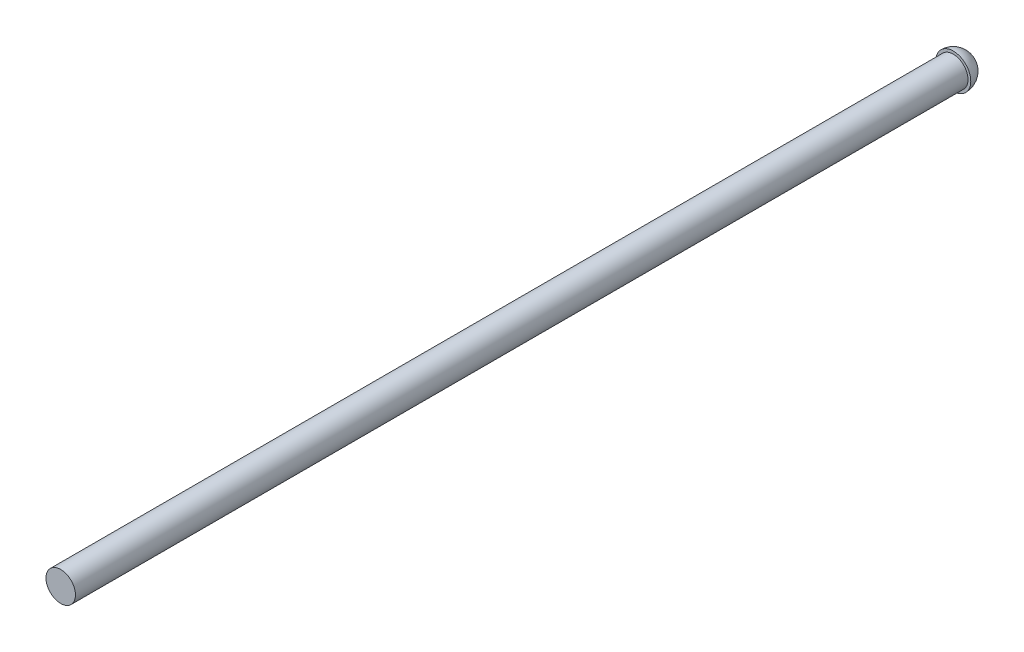
ISO-10303-21;
HEADER;
FILE_DESCRIPTION(('STEP AP214'),'2;1');
FILE_NAME('part.step','',(''),(''),'','','');
FILE_SCHEMA(('AUTOMOTIVE_DESIGN { 1 0 10303 214 1 1 1 1 }'));
ENDSEC;
DATA;
#1=APPLICATION_CONTEXT('core data for automotive mechanical design processes');
#2=APPLICATION_PROTOCOL_DEFINITION('international standard','automotive_design',2000,#1);
#3=PRODUCT_CONTEXT('',#1,'mechanical');
#4=PRODUCT('Part','Part','',(#3));
#5=PRODUCT_RELATED_PRODUCT_CATEGORY('part','',(#4));
#6=PRODUCT_DEFINITION_FORMATION('','',#4);
#7=PRODUCT_DEFINITION_CONTEXT('part definition',#1,'design');
#8=PRODUCT_DEFINITION('design','',#6,#7);
#9=PRODUCT_DEFINITION_SHAPE('','',#8);
#10=(LENGTH_UNIT() NAMED_UNIT(*) SI_UNIT(.MILLI.,.METRE.));
#11=(NAMED_UNIT(*) PLANE_ANGLE_UNIT() SI_UNIT($,.RADIAN.));
#12=(NAMED_UNIT(*) SI_UNIT($,.STERADIAN.) SOLID_ANGLE_UNIT());
#13=UNCERTAINTY_MEASURE_WITH_UNIT(LENGTH_MEASURE(1.E-05),#10,'distance_accuracy_value','');
#14=(GEOMETRIC_REPRESENTATION_CONTEXT(3) GLOBAL_UNCERTAINTY_ASSIGNED_CONTEXT((#13)) GLOBAL_UNIT_ASSIGNED_CONTEXT((#10,
#11,#12)) REPRESENTATION_CONTEXT('',''));
#15=CARTESIAN_POINT('',(0.,0.,0.));
#16=DIRECTION('',(0.,0.,1.));
#17=DIRECTION('',(1.,0.,0.));
#18=AXIS2_PLACEMENT_3D('',#15,#16,#17);
#19=CARTESIAN_POINT('',(-44.45,0.,-19.05));
#20=DIRECTION('',(0.,0.,1.));
#21=DIRECTION('',(1.,0.,0.));
#22=AXIS2_PLACEMENT_3D('',#19,#20,#21);
#23=CYLINDRICAL_SURFACE('',#22,5.35);
#24=CARTESIAN_POINT('',(-44.45,0.,-19.05));
#25=DIRECTION('',(0.,0.,1.));
#26=DIRECTION('',(1.,0.,0.));
#27=AXIS2_PLACEMENT_3D('',#24,#25,#26);
#28=CIRCLE('',#27,5.35);
#29=CARTESIAN_POINT('',(-39.1,0.,-19.05));
#30=VERTEX_POINT('',#29);
#31=EDGE_CURVE('E20',#30,#30,#28,.F.);
#32=ORIENTED_EDGE('',*,*,#31,.F.);
#33=EDGE_LOOP('',(#32));
#34=FACE_BOUND('',#33,.T.);
#35=CARTESIAN_POINT('',(-44.45,0.,304.8));
#36=DIRECTION('',(0.,0.,1.));
#37=DIRECTION('',(1.,0.,0.));
#38=AXIS2_PLACEMENT_3D('',#35,#36,#37);
#39=CIRCLE('',#38,5.35);
#40=CARTESIAN_POINT('',(-39.1,0.,304.8));
#41=VERTEX_POINT('',#40);
#42=EDGE_CURVE('E9',#41,#41,#39,.T.);
#43=ORIENTED_EDGE('',*,*,#42,.F.);
#44=EDGE_LOOP('',(#43));
#45=FACE_BOUND('',#44,.T.);
#46=ADVANCED_FACE('F14',(#34,#45),#23,.T.);
#47=CARTESIAN_POINT('',(-44.45,0.,304.8));
#48=DIRECTION('',(0.,0.,1.));
#49=DIRECTION('',(1.,0.,0.));
#50=AXIS2_PLACEMENT_3D('',#47,#48,#49);
#51=PLANE('',#50);
#52=ORIENTED_EDGE('',*,*,#42,.T.);
#53=EDGE_LOOP('',(#52));
#54=FACE_BOUND('',#53,.T.);
#55=ADVANCED_FACE('F41',(#54),#51,.T.);
#56=CARTESIAN_POINT('',(-38.1,0.,-19.05));
#57=DIRECTION('',(0.,0.,1.));
#58=DIRECTION('',(1.,0.,0.));
#59=AXIS2_PLACEMENT_3D('',#56,#57,#58);
#60=PLANE('',#59);
#61=ORIENTED_EDGE('',*,*,#31,.T.);
#62=EDGE_LOOP('',(#61));
#63=FACE_BOUND('',#62,.T.);
#64=CARTESIAN_POINT('',(-44.45,0.,-19.05));
#65=DIRECTION('',(0.,0.,1.));
#66=DIRECTION('',(1.,0.,0.));
#67=AXIS2_PLACEMENT_3D('',#64,#65,#66);
#68=CIRCLE('',#67,6.35);
#69=CARTESIAN_POINT('',(-38.1,0.,-19.05));
#70=VERTEX_POINT('',#69);
#71=EDGE_CURVE('E24',#70,#70,#68,.T.);
#72=ORIENTED_EDGE('',*,*,#71,.T.);
#73=EDGE_LOOP('',(#72));
#74=FACE_BOUND('',#73,.T.);
#75=ADVANCED_FACE('F31',(#63,#74),#60,.T.);
#76=CARTESIAN_POINT('',(-44.45,0.,-19.05));
#77=DIRECTION('',(0.,0.,1.));
#78=DIRECTION('',(1.,0.,0.));
#79=AXIS2_PLACEMENT_3D('',#76,#77,#78);
#80=SPHERICAL_SURFACE('',#79,6.35);
#81=ORIENTED_EDGE('',*,*,#71,.F.);
#82=EDGE_LOOP('',(#81));
#83=FACE_BOUND('',#82,.T.);
#84=ADVANCED_FACE('F33',(#83),#80,.T.);
#85=CLOSED_SHELL('',(#46,#55,#75,#84));
#86=MANIFOLD_SOLID_BREP('B1',#85);
#87=ADVANCED_BREP_SHAPE_REPRESENTATION('',(#18,#86),#14);
#88=SHAPE_DEFINITION_REPRESENTATION(#9,#87);
ENDSEC;
END-ISO-10303-21;
